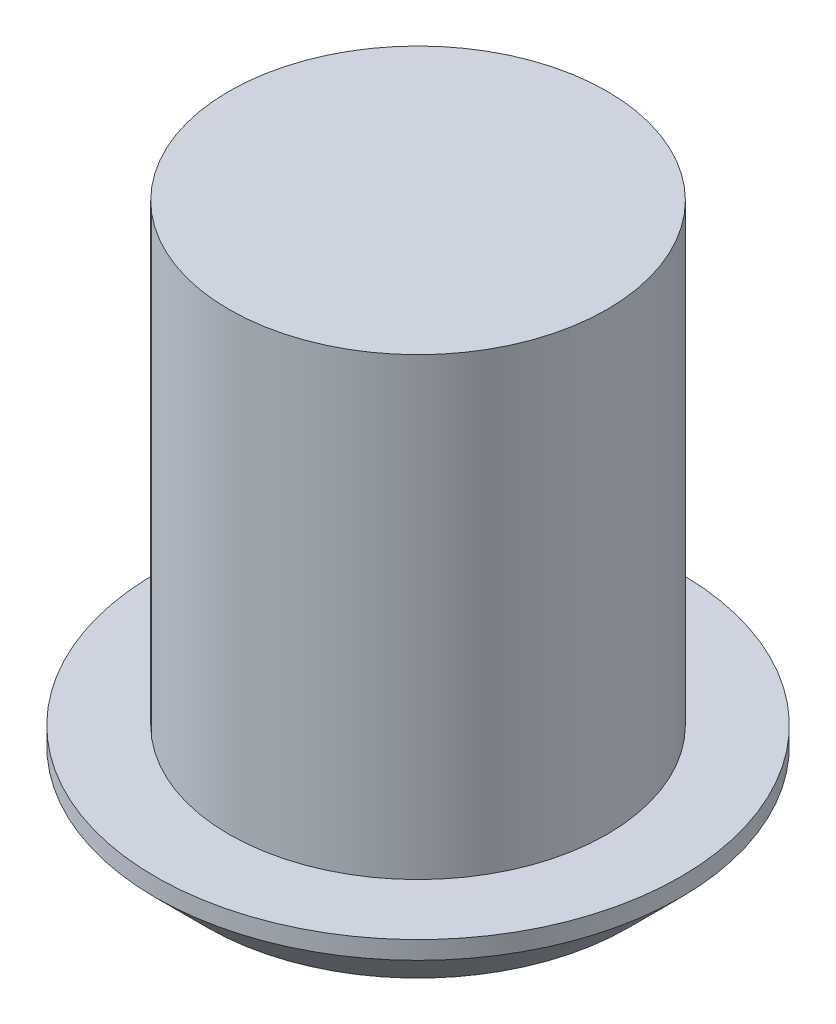
ISO-10303-21;
HEADER;
FILE_DESCRIPTION(('STEP AP214'),'2;1');
FILE_NAME('part.step','',(''),(''),'','','');
FILE_SCHEMA(('AUTOMOTIVE_DESIGN { 1 0 10303 214 1 1 1 1 }'));
ENDSEC;
DATA;
#1=APPLICATION_CONTEXT('core data for automotive mechanical design processes');
#2=APPLICATION_PROTOCOL_DEFINITION('international standard','automotive_design',2000,#1);
#3=PRODUCT_CONTEXT('',#1,'mechanical');
#4=PRODUCT('Part','Part','',(#3));
#5=PRODUCT_RELATED_PRODUCT_CATEGORY('part','',(#4));
#6=PRODUCT_DEFINITION_FORMATION('','',#4);
#7=PRODUCT_DEFINITION_CONTEXT('part definition',#1,'design');
#8=PRODUCT_DEFINITION('design','',#6,#7);
#9=PRODUCT_DEFINITION_SHAPE('','',#8);
#10=(LENGTH_UNIT() NAMED_UNIT(*) SI_UNIT(.MILLI.,.METRE.));
#11=(NAMED_UNIT(*) PLANE_ANGLE_UNIT() SI_UNIT($,.RADIAN.));
#12=(NAMED_UNIT(*) SI_UNIT($,.STERADIAN.) SOLID_ANGLE_UNIT());
#13=UNCERTAINTY_MEASURE_WITH_UNIT(LENGTH_MEASURE(1.E-05),#10,'distance_accuracy_value','');
#14=(GEOMETRIC_REPRESENTATION_CONTEXT(3) GLOBAL_UNCERTAINTY_ASSIGNED_CONTEXT((#13)) GLOBAL_UNIT_ASSIGNED_CONTEXT((#10,
#11,#12)) REPRESENTATION_CONTEXT('',''));
#15=CARTESIAN_POINT('',(0.,0.,0.));
#16=DIRECTION('',(0.,0.,1.));
#17=DIRECTION('',(1.,0.,0.));
#18=AXIS2_PLACEMENT_3D('',#15,#16,#17);
#19=CARTESIAN_POINT('',(0.,-20.3817985485741,0.));
#20=DIRECTION('',(0.,-1.,0.));
#21=DIRECTION('',(0.,0.,-1.));
#22=AXIS2_PLACEMENT_3D('',#19,#20,#21);
#23=PLANE('',#22);
#24=DIRECTION('',(1.,0.,0.));
#25=VECTOR('',#24,1.);
#26=CARTESIAN_POINT('',(-1.,-20.3817985485741,-10.));
#27=LINE('',#26,#25);
#28=CARTESIAN_POINT('',(-1.,-20.3817985485741,-10.));
#29=VERTEX_POINT('',#28);
#30=CARTESIAN_POINT('',(1.,-20.3817985485741,-10.));
#31=VERTEX_POINT('',#30);
#32=EDGE_CURVE('E131',#29,#31,#27,.T.);
#33=ORIENTED_EDGE('',*,*,#32,.T.);
#34=DIRECTION('',(0.,0.,1.));
#35=VECTOR('',#34,1.);
#36=CARTESIAN_POINT('',(1.,-20.3817985485741,-10.));
#37=LINE('',#36,#35);
#38=CARTESIAN_POINT('',(1.,-20.3817985485741,10.));
#39=VERTEX_POINT('',#38);
#40=EDGE_CURVE('E136',#31,#39,#37,.T.);
#41=ORIENTED_EDGE('',*,*,#40,.T.);
#42=DIRECTION('',(-1.,0.,0.));
#43=VECTOR('',#42,1.);
#44=CARTESIAN_POINT('',(1.,-20.3817985485741,10.));
#45=LINE('',#44,#43);
#46=CARTESIAN_POINT('',(-1.,-20.3817985485741,10.));
#47=VERTEX_POINT('',#46);
#48=EDGE_CURVE('E25',#39,#47,#45,.T.);
#49=ORIENTED_EDGE('',*,*,#48,.T.);
#50=DIRECTION('',(0.,0.,-1.));
#51=VECTOR('',#50,1.);
#52=CARTESIAN_POINT('',(-1.,-20.3817985485741,10.));
#53=LINE('',#52,#51);
#54=EDGE_CURVE('E11',#47,#29,#53,.T.);
#55=ORIENTED_EDGE('',*,*,#54,.T.);
#56=EDGE_LOOP('',(#33,#41,#49,#55));
#57=FACE_BOUND('',#56,.T.);
#58=ADVANCED_FACE('F17',(#57),#23,.T.);
#59=CARTESIAN_POINT('',(-1.,-20.3817985485741,10.));
#60=DIRECTION('',(-1.,0.,0.));
#61=DIRECTION('',(0.,0.,1.));
#62=AXIS2_PLACEMENT_3D('',#59,#60,#61);
#63=PLANE('',#62);
#64=DIRECTION('',(0.,0.,-1.));
#65=VECTOR('',#64,1.);
#66=CARTESIAN_POINT('',(-1.,-50.,10.));
#67=LINE('',#66,#65);
#68=CARTESIAN_POINT('',(-1.,-50.,10.));
#69=VERTEX_POINT('',#68);
#70=CARTESIAN_POINT('',(-1.,-50.,-10.));
#71=VERTEX_POINT('',#70);
#72=EDGE_CURVE('E114',#69,#71,#67,.T.);
#73=ORIENTED_EDGE('',*,*,#72,.T.);
#74=DIRECTION('',(0.,-1.,0.));
#75=VECTOR('',#74,1.);
#76=CARTESIAN_POINT('',(-1.,-20.3817985485741,-10.));
#77=LINE('',#76,#75);
#78=EDGE_CURVE('E135',#29,#71,#77,.T.);
#79=ORIENTED_EDGE('',*,*,#78,.F.);
#80=ORIENTED_EDGE('',*,*,#54,.F.);
#81=DIRECTION('',(0.,-1.,0.));
#82=VECTOR('',#81,1.);
#83=CARTESIAN_POINT('',(-1.,-20.3817985485741,10.));
#84=LINE('',#83,#82);
#85=EDGE_CURVE('E125',#47,#69,#84,.T.);
#86=ORIENTED_EDGE('',*,*,#85,.T.);
#87=EDGE_LOOP('',(#73,#79,#80,#86));
#88=FACE_BOUND('',#87,.T.);
#89=ADVANCED_FACE('F146',(#88),#63,.F.);
#90=CARTESIAN_POINT('',(1.,-20.3817985485741,10.));
#91=DIRECTION('',(0.,0.,1.));
#92=DIRECTION('',(1.,0.,0.));
#93=AXIS2_PLACEMENT_3D('',#90,#91,#92);
#94=PLANE('',#93);
#95=DIRECTION('',(-1.,0.,0.));
#96=VECTOR('',#95,1.);
#97=CARTESIAN_POINT('',(1.,-50.,10.));
#98=LINE('',#97,#96);
#99=CARTESIAN_POINT('',(1.,-50.,10.));
#100=VERTEX_POINT('',#99);
#101=EDGE_CURVE('E118',#100,#69,#98,.T.);
#102=ORIENTED_EDGE('',*,*,#101,.T.);
#103=ORIENTED_EDGE('',*,*,#85,.F.);
#104=ORIENTED_EDGE('',*,*,#48,.F.);
#105=DIRECTION('',(0.,-1.,0.));
#106=VECTOR('',#105,1.);
#107=CARTESIAN_POINT('',(1.,-20.3817985485741,10.));
#108=LINE('',#107,#106);
#109=EDGE_CURVE('E139',#39,#100,#108,.T.);
#110=ORIENTED_EDGE('',*,*,#109,.T.);
#111=EDGE_LOOP('',(#102,#103,#104,#110));
#112=FACE_BOUND('',#111,.T.);
#113=ADVANCED_FACE('F150',(#112),#94,.F.);
#114=CARTESIAN_POINT('',(1.,-20.3817985485741,-10.));
#115=DIRECTION('',(1.,0.,0.));
#116=DIRECTION('',(0.,1.,0.));
#117=AXIS2_PLACEMENT_3D('',#114,#115,#116);
#118=PLANE('',#117);
#119=DIRECTION('',(0.,0.,1.));
#120=VECTOR('',#119,1.);
#121=CARTESIAN_POINT('',(1.,-50.,-10.));
#122=LINE('',#121,#120);
#123=CARTESIAN_POINT('',(1.,-50.,-10.));
#124=VERTEX_POINT('',#123);
#125=EDGE_CURVE('E106',#124,#100,#122,.T.);
#126=ORIENTED_EDGE('',*,*,#125,.T.);
#127=ORIENTED_EDGE('',*,*,#109,.F.);
#128=ORIENTED_EDGE('',*,*,#40,.F.);
#129=DIRECTION('',(0.,-1.,0.));
#130=VECTOR('',#129,1.);
#131=CARTESIAN_POINT('',(1.,-20.3817985485741,-10.));
#132=LINE('',#131,#130);
#133=EDGE_CURVE('E128',#31,#124,#132,.T.);
#134=ORIENTED_EDGE('',*,*,#133,.T.);
#135=EDGE_LOOP('',(#126,#127,#128,#134));
#136=FACE_BOUND('',#135,.T.);
#137=ADVANCED_FACE('F161',(#136),#118,.F.);
#138=CARTESIAN_POINT('',(-1.,-20.3817985485741,-10.));
#139=DIRECTION('',(0.,0.,-1.));
#140=DIRECTION('',(0.,-1.,0.));
#141=AXIS2_PLACEMENT_3D('',#138,#139,#140);
#142=PLANE('',#141);
#143=DIRECTION('',(1.,0.,0.));
#144=VECTOR('',#143,1.);
#145=CARTESIAN_POINT('',(-1.,-50.,-10.));
#146=LINE('',#145,#144);
#147=EDGE_CURVE('E110',#71,#124,#146,.T.);
#148=ORIENTED_EDGE('',*,*,#147,.T.);
#149=ORIENTED_EDGE('',*,*,#133,.F.);
#150=ORIENTED_EDGE('',*,*,#32,.F.);
#151=ORIENTED_EDGE('',*,*,#78,.T.);
#152=EDGE_LOOP('',(#148,#149,#150,#151));
#153=FACE_BOUND('',#152,.T.);
#154=ADVANCED_FACE('F157',(#153),#142,.F.);
#155=CARTESIAN_POINT('',(0.,-45.,0.));
#156=DIRECTION('',(0.,1.,0.));
#157=DIRECTION('',(0.,0.,1.));
#158=AXIS2_PLACEMENT_3D('',#155,#156,#157);
#159=CONICAL_SURFACE('',#158,25.,0.785398163397448);
#160=CARTESIAN_POINT('',(0.,-45.,0.));
#161=DIRECTION('',(0.,1.,0.));
#162=DIRECTION('',(0.,0.,1.));
#163=AXIS2_PLACEMENT_3D('',#160,#161,#162);
#164=CIRCLE('',#163,25.);
#165=CARTESIAN_POINT('',(0.,-45.,25.));
#166=VERTEX_POINT('',#165);
#167=EDGE_CURVE('E98',#166,#166,#164,.T.);
#168=ORIENTED_EDGE('',*,*,#167,.F.);
#169=EDGE_LOOP('',(#168));
#170=FACE_BOUND('',#169,.T.);
#171=CARTESIAN_POINT('',(0.,-50.,0.));
#172=DIRECTION('',(0.,-1.,0.));
#173=DIRECTION('',(0.,0.,1.));
#174=AXIS2_PLACEMENT_3D('',#171,#172,#173);
#175=CIRCLE('',#174,20.);
#176=CARTESIAN_POINT('',(0.,-50.,20.));
#177=VERTEX_POINT('',#176);
#178=EDGE_CURVE('E122',#177,#177,#175,.T.);
#179=ORIENTED_EDGE('',*,*,#178,.F.);
#180=EDGE_LOOP('',(#179));
#181=FACE_BOUND('',#180,.T.);
#182=ADVANCED_FACE('F168',(#170,#181),#159,.T.);
#183=CARTESIAN_POINT('',(0.,-50.,0.));
#184=DIRECTION('',(0.,1.,0.));
#185=DIRECTION('',(1.,0.,0.));
#186=AXIS2_PLACEMENT_3D('',#183,#184,#185);
#187=PLANE('',#186);
#188=ORIENTED_EDGE('',*,*,#178,.T.);
#189=EDGE_LOOP('',(#188));
#190=FACE_BOUND('',#189,.T.);
#191=ORIENTED_EDGE('',*,*,#125,.F.);
#192=ORIENTED_EDGE('',*,*,#147,.F.);
#193=ORIENTED_EDGE('',*,*,#72,.F.);
#194=ORIENTED_EDGE('',*,*,#101,.F.);
#195=EDGE_LOOP('',(#191,#192,#193,#194));
#196=FACE_BOUND('',#195,.T.);
#197=ADVANCED_FACE('F154',(#190,#196),#187,.F.);
#198=CARTESIAN_POINT('',(0.,-43.2869916461915,0.));
#199=DIRECTION('',(0.,1.,0.));
#200=DIRECTION('',(1.,0.,0.));
#201=AXIS2_PLACEMENT_3D('',#198,#199,#200);
#202=PLANE('',#201);
#203=CARTESIAN_POINT('',(0.,-43.2869916461915,0.));
#204=DIRECTION('',(0.,1.,0.));
#205=DIRECTION('',(1.,0.,0.));
#206=AXIS2_PLACEMENT_3D('',#203,#204,#205);
#207=CIRCLE('',#206,25.);
#208=CARTESIAN_POINT('',(25.,-43.2869916461915,0.));
#209=VERTEX_POINT('',#208);
#210=EDGE_CURVE('E103',#209,#209,#207,.T.);
#211=ORIENTED_EDGE('',*,*,#210,.T.);
#212=EDGE_LOOP('',(#211));
#213=FACE_BOUND('',#212,.T.);
#214=CARTESIAN_POINT('',(0.,-43.2869916461915,0.));
#215=DIRECTION('',(0.,-1.,0.));
#216=DIRECTION('',(0.,0.,1.));
#217=AXIS2_PLACEMENT_3D('',#214,#215,#216);
#218=CIRCLE('',#217,18.);
#219=CARTESIAN_POINT('',(0.,-43.2869916461915,18.));
#220=VERTEX_POINT('',#219);
#221=EDGE_CURVE('E88',#220,#220,#218,.T.);
#222=ORIENTED_EDGE('',*,*,#221,.T.);
#223=EDGE_LOOP('',(#222));
#224=FACE_BOUND('',#223,.T.);
#225=ADVANCED_FACE('F89',(#213,#224),#202,.T.);
#226=CARTESIAN_POINT('',(0.,-35.4079380288961,0.));
#227=DIRECTION('',(0.,-1.,0.));
#228=DIRECTION('',(0.,0.,-1.));
#229=AXIS2_PLACEMENT_3D('',#226,#227,#228);
#230=CYLINDRICAL_SURFACE('',#229,25.);
#231=ORIENTED_EDGE('',*,*,#210,.F.);
#232=EDGE_LOOP('',(#231));
#233=FACE_BOUND('',#232,.T.);
#234=ORIENTED_EDGE('',*,*,#167,.T.);
#235=EDGE_LOOP('',(#234));
#236=FACE_BOUND('',#235,.T.);
#237=ADVANCED_FACE('F191',(#233,#236),#230,.T.);
#238=CARTESIAN_POINT('',(0.,0.,0.));
#239=DIRECTION('',(0.,1.,0.));
#240=DIRECTION('',(1.,0.,0.));
#241=AXIS2_PLACEMENT_3D('',#238,#239,#240);
#242=PLANE('',#241);
#243=CARTESIAN_POINT('',(0.,0.,0.));
#244=DIRECTION('',(0.,1.,0.));
#245=DIRECTION('',(1.,0.,0.));
#246=AXIS2_PLACEMENT_3D('',#243,#244,#245);
#247=CIRCLE('',#246,18.);
#248=CARTESIAN_POINT('',(18.,0.,0.));
#249=VERTEX_POINT('',#248);
#250=EDGE_CURVE('E92',#249,#249,#247,.T.);
#251=ORIENTED_EDGE('',*,*,#250,.T.);
#252=EDGE_LOOP('',(#251));
#253=FACE_BOUND('',#252,.T.);
#254=ADVANCED_FACE('F193',(#253),#242,.T.);
#255=CARTESIAN_POINT('',(0.,-50.,0.));
#256=DIRECTION('',(0.,1.,0.));
#257=DIRECTION('',(0.,0.,1.));
#258=AXIS2_PLACEMENT_3D('',#255,#256,#257);
#259=CYLINDRICAL_SURFACE('',#258,18.);
#260=ORIENTED_EDGE('',*,*,#250,.F.);
#261=EDGE_LOOP('',(#260));
#262=FACE_BOUND('',#261,.T.);
#263=ORIENTED_EDGE('',*,*,#221,.F.);
#264=EDGE_LOOP('',(#263));
#265=FACE_BOUND('',#264,.T.);
#266=ADVANCED_FACE('F200',(#262,#265),#259,.T.);
#267=CLOSED_SHELL('',(#58,#89,#113,#137,#154,#182,#197,#225,#237,#254,#266));
#268=MANIFOLD_SOLID_BREP('B1',#267);
#269=ADVANCED_BREP_SHAPE_REPRESENTATION('',(#18,#268),#14);
#270=SHAPE_DEFINITION_REPRESENTATION(#9,#269);
ENDSEC;
END-ISO-10303-21;
